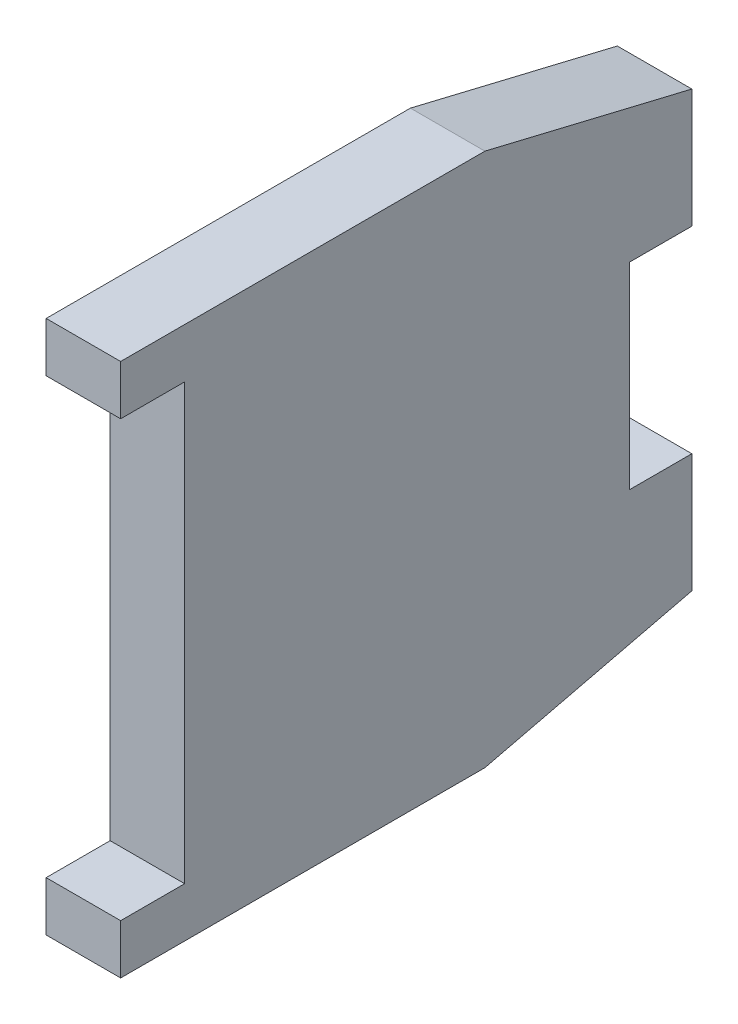
ISO-10303-21;
HEADER;
FILE_DESCRIPTION(('STEP AP214'),'2;1');
FILE_NAME('part.step','',(''),(''),'','','');
FILE_SCHEMA(('AUTOMOTIVE_DESIGN { 1 0 10303 214 1 1 1 1 }'));
ENDSEC;
DATA;
#1=APPLICATION_CONTEXT('core data for automotive mechanical design processes');
#2=APPLICATION_PROTOCOL_DEFINITION('international standard','automotive_design',2000,#1);
#3=PRODUCT_CONTEXT('',#1,'mechanical');
#4=PRODUCT('Part','Part','',(#3));
#5=PRODUCT_RELATED_PRODUCT_CATEGORY('part','',(#4));
#6=PRODUCT_DEFINITION_FORMATION('','',#4);
#7=PRODUCT_DEFINITION_CONTEXT('part definition',#1,'design');
#8=PRODUCT_DEFINITION('design','',#6,#7);
#9=PRODUCT_DEFINITION_SHAPE('','',#8);
#10=(LENGTH_UNIT() NAMED_UNIT(*) SI_UNIT(.MILLI.,.METRE.));
#11=(NAMED_UNIT(*) PLANE_ANGLE_UNIT() SI_UNIT($,.RADIAN.));
#12=(NAMED_UNIT(*) SI_UNIT($,.STERADIAN.) SOLID_ANGLE_UNIT());
#13=UNCERTAINTY_MEASURE_WITH_UNIT(LENGTH_MEASURE(1.E-05),#10,'distance_accuracy_value','');
#14=(GEOMETRIC_REPRESENTATION_CONTEXT(3) GLOBAL_UNCERTAINTY_ASSIGNED_CONTEXT((#13)) GLOBAL_UNIT_ASSIGNED_CONTEXT((#10,
#11,#12)) REPRESENTATION_CONTEXT('',''));
#15=CARTESIAN_POINT('',(0.,0.,0.));
#16=DIRECTION('',(0.,0.,1.));
#17=DIRECTION('',(1.,0.,0.));
#18=AXIS2_PLACEMENT_3D('',#15,#16,#17);
#19=CARTESIAN_POINT('',(-3.,17.5,0.));
#20=DIRECTION('',(0.,-1.,0.));
#21=DIRECTION('',(0.,0.,-1.));
#22=AXIS2_PLACEMENT_3D('',#19,#20,#21);
#23=PLANE('',#22);
#24=DIRECTION('',(1.,0.,0.));
#25=VECTOR('',#24,1.);
#26=CARTESIAN_POINT('',(-3.,17.5,-5.15334352392346));
#27=LINE('',#26,#25);
#28=CARTESIAN_POINT('',(-3.,17.5,-5.15334352392346));
#29=VERTEX_POINT('',#28);
#30=CARTESIAN_POINT('',(3.,17.5,-5.15334352392346));
#31=VERTEX_POINT('',#30);
#32=EDGE_CURVE('E38',#29,#31,#27,.T.);
#33=ORIENTED_EDGE('',*,*,#32,.T.);
#34=DIRECTION('',(0.,0.,-1.));
#35=VECTOR('',#34,1.);
#36=CARTESIAN_POINT('',(3.,17.5,0.));
#37=LINE('',#36,#35);
#38=CARTESIAN_POINT('',(3.,17.5,0.));
#39=VERTEX_POINT('',#38);
#40=EDGE_CURVE('E135',#39,#31,#37,.T.);
#41=ORIENTED_EDGE('',*,*,#40,.F.);
#42=DIRECTION('',(1.,0.,0.));
#43=VECTOR('',#42,1.);
#44=CARTESIAN_POINT('',(-3.,17.5,0.));
#45=LINE('',#44,#43);
#46=CARTESIAN_POINT('',(-3.,17.5,0.));
#47=VERTEX_POINT('',#46);
#48=EDGE_CURVE('E11',#47,#39,#45,.T.);
#49=ORIENTED_EDGE('',*,*,#48,.F.);
#50=DIRECTION('',(0.,0.,-1.));
#51=VECTOR('',#50,1.);
#52=CARTESIAN_POINT('',(-3.,17.5,0.));
#53=LINE('',#52,#51);
#54=EDGE_CURVE('E136',#47,#29,#53,.T.);
#55=ORIENTED_EDGE('',*,*,#54,.T.);
#56=EDGE_LOOP('',(#33,#41,#49,#55));
#57=FACE_BOUND('',#56,.T.);
#58=ADVANCED_FACE('F35',(#57),#23,.T.);
#59=CARTESIAN_POINT('',(-3.,17.5,0.));
#60=DIRECTION('',(0.,0.,1.));
#61=DIRECTION('',(0.,-1.,0.));
#62=AXIS2_PLACEMENT_3D('',#59,#60,#61);
#63=PLANE('',#62);
#64=ORIENTED_EDGE('',*,*,#48,.T.);
#65=DIRECTION('',(0.,-1.,0.));
#66=VECTOR('',#65,1.);
#67=CARTESIAN_POINT('',(3.,17.5,0.));
#68=LINE('',#67,#66);
#69=CARTESIAN_POINT('',(3.,21.5,0.));
#70=VERTEX_POINT('',#69);
#71=EDGE_CURVE('E153',#70,#39,#68,.T.);
#72=ORIENTED_EDGE('',*,*,#71,.F.);
#73=DIRECTION('',(1.,0.,0.));
#74=VECTOR('',#73,1.);
#75=CARTESIAN_POINT('',(-3.,21.5,0.));
#76=LINE('',#75,#74);
#77=CARTESIAN_POINT('',(-3.,21.5,0.));
#78=VERTEX_POINT('',#77);
#79=EDGE_CURVE('E43',#78,#70,#76,.T.);
#80=ORIENTED_EDGE('',*,*,#79,.F.);
#81=DIRECTION('',(0.,-1.,0.));
#82=VECTOR('',#81,1.);
#83=CARTESIAN_POINT('',(-3.,17.5,0.));
#84=LINE('',#83,#82);
#85=EDGE_CURVE('E141',#78,#47,#84,.T.);
#86=ORIENTED_EDGE('',*,*,#85,.T.);
#87=EDGE_LOOP('',(#64,#72,#80,#86));
#88=FACE_BOUND('',#87,.T.);
#89=ADVANCED_FACE('F289',(#88),#63,.T.);
#90=CARTESIAN_POINT('',(-3.,21.5,0.));
#91=DIRECTION('',(0.,1.,0.));
#92=DIRECTION('',(0.,0.,1.));
#93=AXIS2_PLACEMENT_3D('',#90,#91,#92);
#94=PLANE('',#93);
#95=ORIENTED_EDGE('',*,*,#79,.T.);
#96=DIRECTION('',(0.,0.,1.));
#97=VECTOR('',#96,1.);
#98=CARTESIAN_POINT('',(3.,21.5,0.));
#99=LINE('',#98,#97);
#100=CARTESIAN_POINT('',(3.,21.5,-29.3330418003506));
#101=VERTEX_POINT('',#100);
#102=EDGE_CURVE('E184',#101,#70,#99,.T.);
#103=ORIENTED_EDGE('',*,*,#102,.F.);
#104=DIRECTION('',(1.,0.,0.));
#105=VECTOR('',#104,1.);
#106=CARTESIAN_POINT('',(-3.,21.5,-29.3330418003506));
#107=LINE('',#106,#105);
#108=CARTESIAN_POINT('',(-3.,21.5,-29.3330418003506));
#109=VERTEX_POINT('',#108);
#110=EDGE_CURVE('E224',#109,#101,#107,.T.);
#111=ORIENTED_EDGE('',*,*,#110,.F.);
#112=DIRECTION('',(0.,0.,1.));
#113=VECTOR('',#112,1.);
#114=CARTESIAN_POINT('',(-3.,21.5,0.));
#115=LINE('',#114,#113);
#116=EDGE_CURVE('E220',#109,#78,#115,.T.);
#117=ORIENTED_EDGE('',*,*,#116,.T.);
#118=EDGE_LOOP('',(#95,#103,#111,#117));
#119=FACE_BOUND('',#118,.T.);
#120=ADVANCED_FACE('F288',(#119),#94,.T.);
#121=CARTESIAN_POINT('',(-3.,21.5,-29.3330418003506));
#122=DIRECTION('',(0.,0.972388228316411,-0.233369092708678));
#123=DIRECTION('',(0.,0.233369092708678,0.972388228316411));
#124=AXIS2_PLACEMENT_3D('',#121,#122,#123);
#125=PLANE('',#124);
#126=ORIENTED_EDGE('',*,*,#110,.T.);
#127=DIRECTION('',(0.,0.233369092708678,0.972388228316411));
#128=VECTOR('',#127,1.);
#129=CARTESIAN_POINT('',(3.,21.5,-29.3330418003506));
#130=LINE('',#129,#128);
#131=CARTESIAN_POINT('',(3.,17.5,-46.));
#132=VERTEX_POINT('',#131);
#133=EDGE_CURVE('E181',#132,#101,#130,.T.);
#134=ORIENTED_EDGE('',*,*,#133,.F.);
#135=DIRECTION('',(1.,0.,0.));
#136=VECTOR('',#135,1.);
#137=CARTESIAN_POINT('',(-3.,17.5,-46.));
#138=LINE('',#137,#136);
#139=CARTESIAN_POINT('',(-3.,17.5,-46.));
#140=VERTEX_POINT('',#139);
#141=EDGE_CURVE('E226',#140,#132,#138,.T.);
#142=ORIENTED_EDGE('',*,*,#141,.F.);
#143=DIRECTION('',(0.,0.233369092708678,0.972388228316411));
#144=VECTOR('',#143,1.);
#145=CARTESIAN_POINT('',(-3.,21.5,-29.3330418003506));
#146=LINE('',#145,#144);
#147=EDGE_CURVE('E217',#140,#109,#146,.T.);
#148=ORIENTED_EDGE('',*,*,#147,.T.);
#149=EDGE_LOOP('',(#126,#134,#142,#148));
#150=FACE_BOUND('',#149,.T.);
#151=ADVANCED_FACE('F284',(#150),#125,.T.);
#152=CARTESIAN_POINT('',(-3.,17.5,-46.));
#153=DIRECTION('',(0.,0.,-1.));
#154=DIRECTION('',(-1.,0.,0.));
#155=AXIS2_PLACEMENT_3D('',#152,#153,#154);
#156=PLANE('',#155);
#157=ORIENTED_EDGE('',*,*,#141,.T.);
#158=DIRECTION('',(0.,1.,0.));
#159=VECTOR('',#158,1.);
#160=CARTESIAN_POINT('',(3.,17.5,-46.));
#161=LINE('',#160,#159);
#162=CARTESIAN_POINT('',(3.,7.93406177536711,-46.));
#163=VERTEX_POINT('',#162);
#164=EDGE_CURVE('E178',#163,#132,#161,.T.);
#165=ORIENTED_EDGE('',*,*,#164,.F.);
#166=DIRECTION('',(1.,0.,0.));
#167=VECTOR('',#166,1.);
#168=CARTESIAN_POINT('',(-3.,7.93406177536711,-46.));
#169=LINE('',#168,#167);
#170=CARTESIAN_POINT('',(-3.,7.93406177536711,-46.));
#171=VERTEX_POINT('',#170);
#172=EDGE_CURVE('E228',#171,#163,#169,.T.);
#173=ORIENTED_EDGE('',*,*,#172,.F.);
#174=DIRECTION('',(0.,1.,0.));
#175=VECTOR('',#174,1.);
#176=CARTESIAN_POINT('',(-3.,17.5,-46.));
#177=LINE('',#176,#175);
#178=EDGE_CURVE('E214',#171,#140,#177,.T.);
#179=ORIENTED_EDGE('',*,*,#178,.T.);
#180=EDGE_LOOP('',(#157,#165,#173,#179));
#181=FACE_BOUND('',#180,.T.);
#182=ADVANCED_FACE('F279',(#181),#156,.T.);
#183=CARTESIAN_POINT('',(-3.,7.93406177536711,-46.));
#184=DIRECTION('',(0.,-1.,0.));
#185=DIRECTION('',(0.,0.,-1.));
#186=AXIS2_PLACEMENT_3D('',#183,#184,#185);
#187=PLANE('',#186);
#188=ORIENTED_EDGE('',*,*,#172,.T.);
#189=DIRECTION('',(0.,0.,-1.));
#190=VECTOR('',#189,1.);
#191=CARTESIAN_POINT('',(3.,7.93406177536711,-46.));
#192=LINE('',#191,#190);
#193=CARTESIAN_POINT('',(3.,7.93406177536711,-40.962815164441));
#194=VERTEX_POINT('',#193);
#195=EDGE_CURVE('E175',#194,#163,#192,.T.);
#196=ORIENTED_EDGE('',*,*,#195,.F.);
#197=DIRECTION('',(1.,0.,0.));
#198=VECTOR('',#197,1.);
#199=CARTESIAN_POINT('',(-3.,7.93406177536711,-40.962815164441));
#200=LINE('',#199,#198);
#201=CARTESIAN_POINT('',(-3.,7.93406177536711,-40.962815164441));
#202=VERTEX_POINT('',#201);
#203=EDGE_CURVE('E230',#202,#194,#200,.T.);
#204=ORIENTED_EDGE('',*,*,#203,.F.);
#205=DIRECTION('',(0.,0.,-1.));
#206=VECTOR('',#205,1.);
#207=CARTESIAN_POINT('',(-3.,7.93406177536711,-46.));
#208=LINE('',#207,#206);
#209=EDGE_CURVE('E211',#202,#171,#208,.T.);
#210=ORIENTED_EDGE('',*,*,#209,.T.);
#211=EDGE_LOOP('',(#188,#196,#204,#210));
#212=FACE_BOUND('',#211,.T.);
#213=ADVANCED_FACE('F277',(#212),#187,.T.);
#214=CARTESIAN_POINT('',(-3.,7.93406177536711,-40.962815164441));
#215=DIRECTION('',(0.,0.,-1.));
#216=DIRECTION('',(-1.,0.,0.));
#217=AXIS2_PLACEMENT_3D('',#214,#215,#216);
#218=PLANE('',#217);
#219=ORIENTED_EDGE('',*,*,#203,.T.);
#220=DIRECTION('',(0.,1.,0.));
#221=VECTOR('',#220,1.);
#222=CARTESIAN_POINT('',(3.,7.93406177536711,-40.962815164441));
#223=LINE('',#222,#221);
#224=CARTESIAN_POINT('',(3.,-7.93406177536711,-40.962815164441));
#225=VERTEX_POINT('',#224);
#226=EDGE_CURVE('E172',#225,#194,#223,.T.);
#227=ORIENTED_EDGE('',*,*,#226,.F.);
#228=DIRECTION('',(1.,0.,0.));
#229=VECTOR('',#228,1.);
#230=CARTESIAN_POINT('',(-3.,-7.93406177536711,-40.962815164441));
#231=LINE('',#230,#229);
#232=CARTESIAN_POINT('',(-3.,-7.93406177536711,-40.962815164441));
#233=VERTEX_POINT('',#232);
#234=EDGE_CURVE('E232',#233,#225,#231,.T.);
#235=ORIENTED_EDGE('',*,*,#234,.F.);
#236=DIRECTION('',(0.,1.,0.));
#237=VECTOR('',#236,1.);
#238=CARTESIAN_POINT('',(-3.,7.93406177536711,-40.962815164441));
#239=LINE('',#238,#237);
#240=EDGE_CURVE('E208',#233,#202,#239,.T.);
#241=ORIENTED_EDGE('',*,*,#240,.T.);
#242=EDGE_LOOP('',(#219,#227,#235,#241));
#243=FACE_BOUND('',#242,.T.);
#244=ADVANCED_FACE('F272',(#243),#218,.T.);
#245=CARTESIAN_POINT('',(-3.,-7.93406177536711,-45.9999999999999));
#246=DIRECTION('',(0.,1.,0.));
#247=DIRECTION('',(0.,0.,1.));
#248=AXIS2_PLACEMENT_3D('',#245,#246,#247);
#249=PLANE('',#248);
#250=ORIENTED_EDGE('',*,*,#234,.T.);
#251=DIRECTION('',(0.,0.,1.));
#252=VECTOR('',#251,1.);
#253=CARTESIAN_POINT('',(3.,-7.93406177536711,-45.9999999999999));
#254=LINE('',#253,#252);
#255=CARTESIAN_POINT('',(3.,-7.93406177536711,-45.9999999999999));
#256=VERTEX_POINT('',#255);
#257=EDGE_CURVE('E169',#256,#225,#254,.T.);
#258=ORIENTED_EDGE('',*,*,#257,.F.);
#259=DIRECTION('',(1.,0.,0.));
#260=VECTOR('',#259,1.);
#261=CARTESIAN_POINT('',(-3.,-7.93406177536711,-45.9999999999999));
#262=LINE('',#261,#260);
#263=CARTESIAN_POINT('',(-3.,-7.93406177536711,-45.9999999999999));
#264=VERTEX_POINT('',#263);
#265=EDGE_CURVE('E234',#264,#256,#262,.T.);
#266=ORIENTED_EDGE('',*,*,#265,.F.);
#267=DIRECTION('',(0.,0.,1.));
#268=VECTOR('',#267,1.);
#269=CARTESIAN_POINT('',(-3.,-7.93406177536711,-45.9999999999999));
#270=LINE('',#269,#268);
#271=EDGE_CURVE('E205',#264,#233,#270,.T.);
#272=ORIENTED_EDGE('',*,*,#271,.T.);
#273=EDGE_LOOP('',(#250,#258,#266,#272));
#274=FACE_BOUND('',#273,.T.);
#275=ADVANCED_FACE('F267',(#274),#249,.T.);
#276=CARTESIAN_POINT('',(-3.,-17.5,-45.9999999999999));
#277=DIRECTION('',(0.,0.,-1.));
#278=DIRECTION('',(-1.,0.,0.));
#279=AXIS2_PLACEMENT_3D('',#276,#277,#278);
#280=PLANE('',#279);
#281=ORIENTED_EDGE('',*,*,#265,.T.);
#282=DIRECTION('',(0.,1.,0.));
#283=VECTOR('',#282,1.);
#284=CARTESIAN_POINT('',(3.,-17.5,-45.9999999999999));
#285=LINE('',#284,#283);
#286=CARTESIAN_POINT('',(3.,-17.5,-45.9999999999999));
#287=VERTEX_POINT('',#286);
#288=EDGE_CURVE('E166',#287,#256,#285,.T.);
#289=ORIENTED_EDGE('',*,*,#288,.F.);
#290=DIRECTION('',(1.,0.,0.));
#291=VECTOR('',#290,1.);
#292=CARTESIAN_POINT('',(-3.,-17.5,-45.9999999999999));
#293=LINE('',#292,#291);
#294=CARTESIAN_POINT('',(-3.,-17.5,-45.9999999999999));
#295=VERTEX_POINT('',#294);
#296=EDGE_CURVE('E236',#295,#287,#293,.T.);
#297=ORIENTED_EDGE('',*,*,#296,.F.);
#298=DIRECTION('',(0.,1.,0.));
#299=VECTOR('',#298,1.);
#300=CARTESIAN_POINT('',(-3.,-17.5,-45.9999999999999));
#301=LINE('',#300,#299);
#302=EDGE_CURVE('E202',#295,#264,#301,.T.);
#303=ORIENTED_EDGE('',*,*,#302,.T.);
#304=EDGE_LOOP('',(#281,#289,#297,#303));
#305=FACE_BOUND('',#304,.T.);
#306=ADVANCED_FACE('F265',(#305),#280,.T.);
#307=CARTESIAN_POINT('',(-3.,-21.5,-29.3330418003506));
#308=DIRECTION('',(0.,-0.97238822831641,-0.233369092708679));
#309=DIRECTION('',(0.,0.233369092708679,-0.972388228316411));
#310=AXIS2_PLACEMENT_3D('',#307,#308,#309);
#311=PLANE('',#310);
#312=ORIENTED_EDGE('',*,*,#296,.T.);
#313=DIRECTION('',(0.,0.233369092708679,-0.972388228316411));
#314=VECTOR('',#313,1.);
#315=CARTESIAN_POINT('',(3.,-21.5,-29.3330418003506));
#316=LINE('',#315,#314);
#317=CARTESIAN_POINT('',(3.,-21.5,-29.3330418003506));
#318=VERTEX_POINT('',#317);
#319=EDGE_CURVE('E163',#318,#287,#316,.T.);
#320=ORIENTED_EDGE('',*,*,#319,.F.);
#321=DIRECTION('',(1.,0.,0.));
#322=VECTOR('',#321,1.);
#323=CARTESIAN_POINT('',(-3.,-21.5,-29.3330418003506));
#324=LINE('',#323,#322);
#325=CARTESIAN_POINT('',(-3.,-21.5,-29.3330418003506));
#326=VERTEX_POINT('',#325);
#327=EDGE_CURVE('E238',#326,#318,#324,.T.);
#328=ORIENTED_EDGE('',*,*,#327,.F.);
#329=DIRECTION('',(0.,0.233369092708679,-0.972388228316411));
#330=VECTOR('',#329,1.);
#331=CARTESIAN_POINT('',(-3.,-21.5,-29.3330418003506));
#332=LINE('',#331,#330);
#333=EDGE_CURVE('E199',#326,#295,#332,.T.);
#334=ORIENTED_EDGE('',*,*,#333,.T.);
#335=EDGE_LOOP('',(#312,#320,#328,#334));
#336=FACE_BOUND('',#335,.T.);
#337=ADVANCED_FACE('F260',(#336),#311,.T.);
#338=CARTESIAN_POINT('',(-3.,-21.5,0.));
#339=DIRECTION('',(0.,-1.,0.));
#340=DIRECTION('',(0.,0.,-1.));
#341=AXIS2_PLACEMENT_3D('',#338,#339,#340);
#342=PLANE('',#341);
#343=ORIENTED_EDGE('',*,*,#327,.T.);
#344=DIRECTION('',(0.,0.,-1.));
#345=VECTOR('',#344,1.);
#346=CARTESIAN_POINT('',(3.,-21.5,0.));
#347=LINE('',#346,#345);
#348=CARTESIAN_POINT('',(3.,-21.5,0.));
#349=VERTEX_POINT('',#348);
#350=EDGE_CURVE('E160',#349,#318,#347,.T.);
#351=ORIENTED_EDGE('',*,*,#350,.F.);
#352=DIRECTION('',(1.,0.,0.));
#353=VECTOR('',#352,1.);
#354=CARTESIAN_POINT('',(-3.,-21.5,0.));
#355=LINE('',#354,#353);
#356=CARTESIAN_POINT('',(-3.,-21.5,0.));
#357=VERTEX_POINT('',#356);
#358=EDGE_CURVE('E240',#357,#349,#355,.T.);
#359=ORIENTED_EDGE('',*,*,#358,.F.);
#360=DIRECTION('',(0.,0.,-1.));
#361=VECTOR('',#360,1.);
#362=CARTESIAN_POINT('',(-3.,-21.5,0.));
#363=LINE('',#362,#361);
#364=EDGE_CURVE('E196',#357,#326,#363,.T.);
#365=ORIENTED_EDGE('',*,*,#364,.T.);
#366=EDGE_LOOP('',(#343,#351,#359,#365));
#367=FACE_BOUND('',#366,.T.);
#368=ADVANCED_FACE('F253',(#367),#342,.T.);
#369=CARTESIAN_POINT('',(-3.,-17.5,1.02397635700565E-13));
#370=DIRECTION('',(0.,0.,1.));
#371=DIRECTION('',(0.,-1.,0.));
#372=AXIS2_PLACEMENT_3D('',#369,#370,#371);
#373=PLANE('',#372);
#374=ORIENTED_EDGE('',*,*,#358,.T.);
#375=DIRECTION('',(0.,-1.,0.));
#376=VECTOR('',#375,1.);
#377=CARTESIAN_POINT('',(3.,-17.5,1.02397635700565E-13));
#378=LINE('',#377,#376);
#379=CARTESIAN_POINT('',(3.,-17.5,1.02397635700565E-13));
#380=VERTEX_POINT('',#379);
#381=EDGE_CURVE('E157',#380,#349,#378,.T.);
#382=ORIENTED_EDGE('',*,*,#381,.F.);
#383=DIRECTION('',(1.,0.,0.));
#384=VECTOR('',#383,1.);
#385=CARTESIAN_POINT('',(-3.,-17.5,1.02397635700565E-13));
#386=LINE('',#385,#384);
#387=CARTESIAN_POINT('',(-3.,-17.5,1.02397635700565E-13));
#388=VERTEX_POINT('',#387);
#389=EDGE_CURVE('E242',#388,#380,#386,.T.);
#390=ORIENTED_EDGE('',*,*,#389,.F.);
#391=DIRECTION('',(0.,-1.,0.));
#392=VECTOR('',#391,1.);
#393=CARTESIAN_POINT('',(-3.,-17.5,1.02397635700565E-13));
#394=LINE('',#393,#392);
#395=EDGE_CURVE('E193',#388,#357,#394,.T.);
#396=ORIENTED_EDGE('',*,*,#395,.T.);
#397=EDGE_LOOP('',(#374,#382,#390,#396));
#398=FACE_BOUND('',#397,.T.);
#399=ADVANCED_FACE('F250',(#398),#373,.T.);
#400=CARTESIAN_POINT('',(-3.,-17.5,1.02397635700565E-13));
#401=DIRECTION('',(0.,1.,0.));
#402=DIRECTION('',(0.,0.,1.));
#403=AXIS2_PLACEMENT_3D('',#400,#401,#402);
#404=PLANE('',#403);
#405=ORIENTED_EDGE('',*,*,#389,.T.);
#406=DIRECTION('',(0.,0.,1.));
#407=VECTOR('',#406,1.);
#408=CARTESIAN_POINT('',(3.,-17.5,1.02397635700565E-13));
#409=LINE('',#408,#407);
#410=CARTESIAN_POINT('',(3.,-17.5,-5.15334352392335));
#411=VERTEX_POINT('',#410);
#412=EDGE_CURVE('E148',#411,#380,#409,.T.);
#413=ORIENTED_EDGE('',*,*,#412,.F.);
#414=DIRECTION('',(1.,0.,0.));
#415=VECTOR('',#414,1.);
#416=CARTESIAN_POINT('',(-3.,-17.5,-5.15334352392335));
#417=LINE('',#416,#415);
#418=CARTESIAN_POINT('',(-3.,-17.5,-5.15334352392335));
#419=VERTEX_POINT('',#418);
#420=EDGE_CURVE('E140',#419,#411,#417,.T.);
#421=ORIENTED_EDGE('',*,*,#420,.F.);
#422=DIRECTION('',(0.,0.,1.));
#423=VECTOR('',#422,1.);
#424=CARTESIAN_POINT('',(-3.,-17.5,1.02397635700565E-13));
#425=LINE('',#424,#423);
#426=EDGE_CURVE('E190',#419,#388,#425,.T.);
#427=ORIENTED_EDGE('',*,*,#426,.T.);
#428=EDGE_LOOP('',(#405,#413,#421,#427));
#429=FACE_BOUND('',#428,.T.);
#430=ADVANCED_FACE('F244',(#429),#404,.T.);
#431=CARTESIAN_POINT('',(-3.,17.5,-5.15334352392346));
#432=DIRECTION('',(0.,0.,1.));
#433=DIRECTION('',(0.,-1.,0.));
#434=AXIS2_PLACEMENT_3D('',#431,#432,#433);
#435=PLANE('',#434);
#436=ORIENTED_EDGE('',*,*,#420,.T.);
#437=DIRECTION('',(0.,-1.,0.));
#438=VECTOR('',#437,1.);
#439=CARTESIAN_POINT('',(3.,17.5,-5.15334352392346));
#440=LINE('',#439,#438);
#441=EDGE_CURVE('E143',#31,#411,#440,.T.);
#442=ORIENTED_EDGE('',*,*,#441,.F.);
#443=ORIENTED_EDGE('',*,*,#32,.F.);
#444=DIRECTION('',(0.,-1.,0.));
#445=VECTOR('',#444,1.);
#446=CARTESIAN_POINT('',(-3.,17.5,-5.15334352392346));
#447=LINE('',#446,#445);
#448=EDGE_CURVE('E188',#29,#419,#447,.T.);
#449=ORIENTED_EDGE('',*,*,#448,.T.);
#450=EDGE_LOOP('',(#436,#442,#443,#449));
#451=FACE_BOUND('',#450,.T.);
#452=ADVANCED_FACE('F144',(#451),#435,.T.);
#453=CARTESIAN_POINT('',(-3.,0.,0.));
#454=DIRECTION('',(-1.,0.,0.));
#455=DIRECTION('',(0.,0.,1.));
#456=AXIS2_PLACEMENT_3D('',#453,#454,#455);
#457=PLANE('',#456);
#458=ORIENTED_EDGE('',*,*,#54,.F.);
#459=ORIENTED_EDGE('',*,*,#85,.F.);
#460=ORIENTED_EDGE('',*,*,#116,.F.);
#461=ORIENTED_EDGE('',*,*,#147,.F.);
#462=ORIENTED_EDGE('',*,*,#178,.F.);
#463=ORIENTED_EDGE('',*,*,#209,.F.);
#464=ORIENTED_EDGE('',*,*,#240,.F.);
#465=ORIENTED_EDGE('',*,*,#271,.F.);
#466=ORIENTED_EDGE('',*,*,#302,.F.);
#467=ORIENTED_EDGE('',*,*,#333,.F.);
#468=ORIENTED_EDGE('',*,*,#364,.F.);
#469=ORIENTED_EDGE('',*,*,#395,.F.);
#470=ORIENTED_EDGE('',*,*,#426,.F.);
#471=ORIENTED_EDGE('',*,*,#448,.F.);
#472=EDGE_LOOP('',(#458,#459,#460,#461,#462,#463,#464,#465,#466,#467,#468,#469,#470,#471));
#473=FACE_BOUND('',#472,.T.);
#474=ADVANCED_FACE('F256',(#473),#457,.T.);
#475=CARTESIAN_POINT('',(3.,0.,0.));
#476=DIRECTION('',(-1.,0.,0.));
#477=DIRECTION('',(0.,0.,1.));
#478=AXIS2_PLACEMENT_3D('',#475,#476,#477);
#479=PLANE('',#478);
#480=ORIENTED_EDGE('',*,*,#40,.T.);
#481=ORIENTED_EDGE('',*,*,#441,.T.);
#482=ORIENTED_EDGE('',*,*,#412,.T.);
#483=ORIENTED_EDGE('',*,*,#381,.T.);
#484=ORIENTED_EDGE('',*,*,#350,.T.);
#485=ORIENTED_EDGE('',*,*,#319,.T.);
#486=ORIENTED_EDGE('',*,*,#288,.T.);
#487=ORIENTED_EDGE('',*,*,#257,.T.);
#488=ORIENTED_EDGE('',*,*,#226,.T.);
#489=ORIENTED_EDGE('',*,*,#195,.T.);
#490=ORIENTED_EDGE('',*,*,#164,.T.);
#491=ORIENTED_EDGE('',*,*,#133,.T.);
#492=ORIENTED_EDGE('',*,*,#102,.T.);
#493=ORIENTED_EDGE('',*,*,#71,.T.);
#494=EDGE_LOOP('',(#480,#481,#482,#483,#484,#485,#486,#487,#488,#489,#490,#491,#492,#493));
#495=FACE_BOUND('',#494,.T.);
#496=ADVANCED_FACE('F151',(#495),#479,.F.);
#497=CLOSED_SHELL('',(#58,#89,#120,#151,#182,#213,#244,#275,#306,#337,#368,#399,#430,#452,#474,#496));
#498=MANIFOLD_SOLID_BREP('B2',#497);
#499=ADVANCED_BREP_SHAPE_REPRESENTATION('',(#18,#498),#14);
#500=SHAPE_DEFINITION_REPRESENTATION(#9,#499);
ENDSEC;
END-ISO-10303-21;
